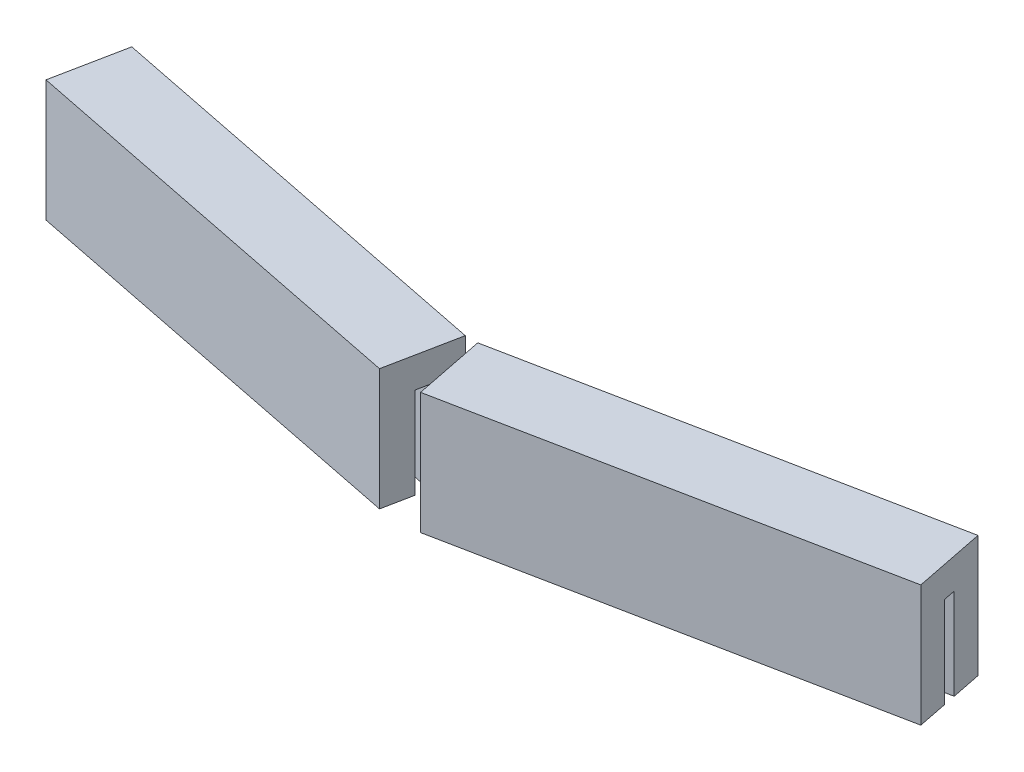
ISO-10303-21;
HEADER;
FILE_DESCRIPTION(('STEP AP214'),'2;1');
FILE_NAME('part.step','',(''),(''),'','','');
FILE_SCHEMA(('AUTOMOTIVE_DESIGN { 1 0 10303 214 1 1 1 1 }'));
ENDSEC;
DATA;
#1=APPLICATION_CONTEXT('core data for automotive mechanical design processes');
#2=APPLICATION_PROTOCOL_DEFINITION('international standard','automotive_design',2000,#1);
#3=PRODUCT_CONTEXT('',#1,'mechanical');
#4=PRODUCT('Part','Part','',(#3));
#5=PRODUCT_RELATED_PRODUCT_CATEGORY('part','',(#4));
#6=PRODUCT_DEFINITION_FORMATION('','',#4);
#7=PRODUCT_DEFINITION_CONTEXT('part definition',#1,'design');
#8=PRODUCT_DEFINITION('design','',#6,#7);
#9=PRODUCT_DEFINITION_SHAPE('','',#8);
#10=(LENGTH_UNIT() NAMED_UNIT(*) SI_UNIT(.MILLI.,.METRE.));
#11=(NAMED_UNIT(*) PLANE_ANGLE_UNIT() SI_UNIT($,.RADIAN.));
#12=(NAMED_UNIT(*) SI_UNIT($,.STERADIAN.) SOLID_ANGLE_UNIT());
#13=UNCERTAINTY_MEASURE_WITH_UNIT(LENGTH_MEASURE(1.E-05),#10,'distance_accuracy_value','');
#14=(GEOMETRIC_REPRESENTATION_CONTEXT(3) GLOBAL_UNCERTAINTY_ASSIGNED_CONTEXT((#13)) GLOBAL_UNIT_ASSIGNED_CONTEXT((#10,
#11,#12)) REPRESENTATION_CONTEXT('',''));
#15=CARTESIAN_POINT('',(0.,0.,0.));
#16=DIRECTION('',(0.,0.,1.));
#17=DIRECTION('',(1.,0.,0.));
#18=AXIS2_PLACEMENT_3D('',#15,#16,#17);
#19=CARTESIAN_POINT('',(22.7660769993046,5.,96.7807247493332));
#20=DIRECTION('',(-0.980580675690921,0.,-0.196116135138181));
#21=DIRECTION('',(-0.196116135138181,0.,0.980580675690921));
#22=AXIS2_PLACEMENT_3D('',#19,#20,#21);
#23=PLANE('',#22);
#24=DIRECTION('',(0.196116135138181,0.,-0.980580675690921));
#25=VECTOR('',#24,1.);
#26=CARTESIAN_POINT('',(22.7660769993046,0.,96.7807247493332));
#27=LINE('',#26,#25);
#28=CARTESIAN_POINT('',(22.7660769993046,0.,96.7807247493332));
#29=VERTEX_POINT('',#28);
#30=CARTESIAN_POINT('',(23.158309269581,0.,94.8195633979514));
#31=VERTEX_POINT('',#30);
#32=EDGE_CURVE('E62',#29,#31,#27,.T.);
#33=ORIENTED_EDGE('',*,*,#32,.T.);
#34=DIRECTION('',(0.,1.,0.));
#35=VECTOR('',#34,1.);
#36=CARTESIAN_POINT('',(23.158309269581,-15.,94.8195633979514));
#37=LINE('',#36,#35);
#38=CARTESIAN_POINT('',(23.158309269581,-15.,94.8195633979514));
#39=VERTEX_POINT('',#38);
#40=EDGE_CURVE('E152',#39,#31,#37,.T.);
#41=ORIENTED_EDGE('',*,*,#40,.F.);
#42=DIRECTION('',(0.196116135138182,0.,-0.980580675690921));
#43=VECTOR('',#42,1.);
#44=CARTESIAN_POINT('',(24.1388899452719,-15.,89.9166600194968));
#45=LINE('',#44,#43);
#46=CARTESIAN_POINT('',(24.1388899452719,-15.,89.9166600194968));
#47=VERTEX_POINT('',#46);
#48=EDGE_CURVE('E146',#39,#47,#45,.T.);
#49=ORIENTED_EDGE('',*,*,#48,.T.);
#50=DIRECTION('',(0.,1.,0.));
#51=VECTOR('',#50,1.);
#52=CARTESIAN_POINT('',(24.1388899452719,-15.,89.9166600194968));
#53=LINE('',#52,#51);
#54=CARTESIAN_POINT('',(24.1388899452719,5.,89.9166600194968));
#55=VERTEX_POINT('',#54);
#56=EDGE_CURVE('E136',#47,#55,#53,.T.);
#57=ORIENTED_EDGE('',*,*,#56,.T.);
#58=DIRECTION('',(0.196116135138181,0.,-0.980580675690921));
#59=VECTOR('',#58,1.);
#60=CARTESIAN_POINT('',(22.7660769993046,5.,96.7807247493332));
#61=LINE('',#60,#59);
#62=CARTESIAN_POINT('',(21.7854963236139,5.,101.683628127787));
#63=VERTEX_POINT('',#62);
#64=EDGE_CURVE('E57',#63,#55,#61,.T.);
#65=ORIENTED_EDGE('',*,*,#64,.F.);
#66=DIRECTION('',(0.,1.,0.));
#67=VECTOR('',#66,1.);
#68=CARTESIAN_POINT('',(21.7854963236139,-15.,101.683628127787));
#69=LINE('',#68,#67);
#70=CARTESIAN_POINT('',(21.7854963236139,-15.,101.683628127787));
#71=VERTEX_POINT('',#70);
#72=EDGE_CURVE('E165',#71,#63,#69,.T.);
#73=ORIENTED_EDGE('',*,*,#72,.F.);
#74=DIRECTION('',(0.196116135138173,0.,-0.980580675690922));
#75=VECTOR('',#74,1.);
#76=CARTESIAN_POINT('',(21.7854963236139,-15.,101.683628127787));
#77=LINE('',#76,#75);
#78=CARTESIAN_POINT('',(22.7660769993046,-15.,96.7807247493332));
#79=VERTEX_POINT('',#78);
#80=EDGE_CURVE('E158',#71,#79,#77,.T.);
#81=ORIENTED_EDGE('',*,*,#80,.T.);
#82=DIRECTION('',(0.,1.,0.));
#83=VECTOR('',#82,1.);
#84=CARTESIAN_POINT('',(22.7660769993046,-15.,96.7807247493332));
#85=LINE('',#84,#83);
#86=EDGE_CURVE('E171',#79,#29,#85,.T.);
#87=ORIENTED_EDGE('',*,*,#86,.T.);
#88=EDGE_LOOP('',(#33,#41,#49,#57,#65,#73,#81,#87));
#89=FACE_BOUND('',#88,.T.);
#90=ADVANCED_FACE('F53',(#89),#23,.F.);
#91=CARTESIAN_POINT('',(-45.4823380287835,5.,81.0914339382787));
#92=DIRECTION('',(0.980580675690921,0.,0.196116135138178));
#93=DIRECTION('',(0.196116135138178,0.,-0.980580675690921));
#94=AXIS2_PLACEMENT_3D('',#91,#92,#93);
#95=PLANE('',#94);
#96=DIRECTION('',(-0.196116135138178,0.,0.980580675690921));
#97=VECTOR('',#96,1.);
#98=CARTESIAN_POINT('',(-45.4823380287835,0.,81.0914339382787));
#99=LINE('',#98,#97);
#100=CARTESIAN_POINT('',(-45.4823380287835,0.,81.0914339382787));
#101=VERTEX_POINT('',#100);
#102=CARTESIAN_POINT('',(-45.8745702990598,0.,83.0525952896605));
#103=VERTEX_POINT('',#102);
#104=EDGE_CURVE('E77',#101,#103,#99,.T.);
#105=ORIENTED_EDGE('',*,*,#104,.T.);
#106=DIRECTION('',(0.,1.,0.));
#107=VECTOR('',#106,1.);
#108=CARTESIAN_POINT('',(-45.8745702990598,-15.,83.0525952896605));
#109=LINE('',#108,#107);
#110=CARTESIAN_POINT('',(-45.8745702990598,-15.,83.0525952896605));
#111=VERTEX_POINT('',#110);
#112=EDGE_CURVE('E168',#111,#103,#109,.T.);
#113=ORIENTED_EDGE('',*,*,#112,.F.);
#114=DIRECTION('',(-0.196116135138174,0.,0.980580675690922));
#115=VECTOR('',#114,1.);
#116=CARTESIAN_POINT('',(-45.8745702990598,-15.,83.0525952896605));
#117=LINE('',#116,#115);
#118=CARTESIAN_POINT('',(-46.8551509747507,-15.,87.9554986681151));
#119=VERTEX_POINT('',#118);
#120=EDGE_CURVE('E164',#111,#119,#117,.T.);
#121=ORIENTED_EDGE('',*,*,#120,.T.);
#122=DIRECTION('',(0.,1.,0.));
#123=VECTOR('',#122,1.);
#124=CARTESIAN_POINT('',(-46.8551509747507,-15.,87.9554986681151));
#125=LINE('',#124,#123);
#126=CARTESIAN_POINT('',(-46.8551509747507,5.,87.9554986681151));
#127=VERTEX_POINT('',#126);
#128=EDGE_CURVE('E124',#119,#127,#125,.T.);
#129=ORIENTED_EDGE('',*,*,#128,.T.);
#130=DIRECTION('',(-0.196116135138178,0.,0.980580675690921));
#131=VECTOR('',#130,1.);
#132=CARTESIAN_POINT('',(-45.4823380287835,5.,81.0914339382787));
#133=LINE('',#132,#131);
#134=CARTESIAN_POINT('',(-44.5017573530925,5.,76.1885305598241));
#135=VERTEX_POINT('',#134);
#136=EDGE_CURVE('E117',#135,#127,#133,.T.);
#137=ORIENTED_EDGE('',*,*,#136,.F.);
#138=DIRECTION('',(0.,1.,0.));
#139=VECTOR('',#138,1.);
#140=CARTESIAN_POINT('',(-44.5017573530925,-15.,76.1885305598241));
#141=LINE('',#140,#139);
#142=CARTESIAN_POINT('',(-44.5017573530925,-15.,76.1885305598241));
#143=VERTEX_POINT('',#142);
#144=EDGE_CURVE('E121',#143,#135,#141,.T.);
#145=ORIENTED_EDGE('',*,*,#144,.F.);
#146=DIRECTION('',(-0.196116135138182,0.,0.980580675690921));
#147=VECTOR('',#146,1.);
#148=CARTESIAN_POINT('',(-45.4823380287835,-15.,81.0914339382787));
#149=LINE('',#148,#147);
#150=CARTESIAN_POINT('',(-45.4823380287835,-15.,81.0914339382787));
#151=VERTEX_POINT('',#150);
#152=EDGE_CURVE('E150',#143,#151,#149,.T.);
#153=ORIENTED_EDGE('',*,*,#152,.T.);
#154=DIRECTION('',(0.,1.,0.));
#155=VECTOR('',#154,1.);
#156=CARTESIAN_POINT('',(-45.4823380287835,-15.,81.0914339382787));
#157=LINE('',#156,#155);
#158=EDGE_CURVE('E137',#151,#101,#157,.T.);
#159=ORIENTED_EDGE('',*,*,#158,.T.);
#160=EDGE_LOOP('',(#105,#113,#121,#129,#137,#145,#153,#159));
#161=FACE_BOUND('',#160,.T.);
#162=ADVANCED_FACE('F119',(#161),#95,.F.);
#163=CARTESIAN_POINT('',(0.,5.,0.));
#164=DIRECTION('',(0.,1.,0.));
#165=DIRECTION('',(0.,0.,1.));
#166=AXIS2_PLACEMENT_3D('',#163,#164,#165);
#167=PLANE('',#166);
#168=ORIENTED_EDGE('',*,*,#136,.T.);
#169=DIRECTION('',(0.980580675690922,0.,0.196116135138174));
#170=VECTOR('',#169,1.);
#171=CARTESIAN_POINT('',(-46.8551509747507,5.,87.9554986681151));
#172=LINE('',#171,#170);
#173=EDGE_CURVE('E140',#127,#63,#172,.T.);
#174=ORIENTED_EDGE('',*,*,#173,.T.);
#175=ORIENTED_EDGE('',*,*,#64,.T.);
#176=DIRECTION('',(-0.980580675690921,0.,-0.196116135138182));
#177=VECTOR('',#176,1.);
#178=CARTESIAN_POINT('',(-44.5017573530925,5.,76.1885305598241));
#179=LINE('',#178,#177);
#180=EDGE_CURVE('E132',#55,#135,#179,.T.);
#181=ORIENTED_EDGE('',*,*,#180,.T.);
#182=EDGE_LOOP('',(#168,#174,#175,#181));
#183=FACE_BOUND('',#182,.T.);
#184=ADVANCED_FACE('F55',(#183),#167,.T.);
#185=CARTESIAN_POINT('',(0.,0.,0.));
#186=DIRECTION('',(0.,1.,0.));
#187=DIRECTION('',(0.,0.,1.));
#188=AXIS2_PLACEMENT_3D('',#185,#186,#187);
#189=PLANE('',#188);
#190=DIRECTION('',(0.980580675690921,0.,0.196116135138182));
#191=VECTOR('',#190,1.);
#192=CARTESIAN_POINT('',(-45.8745702990598,0.,83.0525952896605));
#193=LINE('',#192,#191);
#194=EDGE_CURVE('E12',#103,#29,#193,.T.);
#195=ORIENTED_EDGE('',*,*,#194,.F.);
#196=ORIENTED_EDGE('',*,*,#104,.F.);
#197=DIRECTION('',(-0.980580675690921,0.,-0.196116135138182));
#198=VECTOR('',#197,1.);
#199=CARTESIAN_POINT('',(23.158309269581,0.,94.8195633979514));
#200=LINE('',#199,#198);
#201=EDGE_CURVE('E176',#31,#101,#200,.T.);
#202=ORIENTED_EDGE('',*,*,#201,.F.);
#203=ORIENTED_EDGE('',*,*,#32,.F.);
#204=EDGE_LOOP('',(#195,#196,#202,#203));
#205=FACE_BOUND('',#204,.T.);
#206=ADVANCED_FACE('F199',(#205),#189,.F.);
#207=CARTESIAN_POINT('',(22.7660769993046,-15.,96.7807247493332));
#208=DIRECTION('',(0.196116135138182,0.,-0.980580675690921));
#209=DIRECTION('',(-0.980580675690921,0.,-0.196116135138182));
#210=AXIS2_PLACEMENT_3D('',#207,#208,#209);
#211=PLANE('',#210);
#212=ORIENTED_EDGE('',*,*,#194,.T.);
#213=ORIENTED_EDGE('',*,*,#86,.F.);
#214=DIRECTION('',(-0.980580675690921,0.,-0.196116135138182));
#215=VECTOR('',#214,1.);
#216=CARTESIAN_POINT('',(22.7660769993046,-15.,96.7807247493332));
#217=LINE('',#216,#215);
#218=EDGE_CURVE('E161',#79,#111,#217,.T.);
#219=ORIENTED_EDGE('',*,*,#218,.T.);
#220=ORIENTED_EDGE('',*,*,#112,.T.);
#221=EDGE_LOOP('',(#212,#213,#219,#220));
#222=FACE_BOUND('',#221,.T.);
#223=ADVANCED_FACE('F198',(#222),#211,.T.);
#224=CARTESIAN_POINT('',(-46.8551509747507,-15.,87.9554986681151));
#225=DIRECTION('',(-0.196116135138174,0.,0.980580675690922));
#226=DIRECTION('',(0.980580675690922,0.,0.196116135138174));
#227=AXIS2_PLACEMENT_3D('',#224,#225,#226);
#228=PLANE('',#227);
#229=ORIENTED_EDGE('',*,*,#173,.F.);
#230=ORIENTED_EDGE('',*,*,#128,.F.);
#231=DIRECTION('',(0.980580675690922,0.,0.196116135138174));
#232=VECTOR('',#231,1.);
#233=CARTESIAN_POINT('',(-46.8551509747507,-15.,87.9554986681151));
#234=LINE('',#233,#232);
#235=EDGE_CURVE('E143',#119,#71,#234,.T.);
#236=ORIENTED_EDGE('',*,*,#235,.T.);
#237=ORIENTED_EDGE('',*,*,#72,.T.);
#238=EDGE_LOOP('',(#229,#230,#236,#237));
#239=FACE_BOUND('',#238,.T.);
#240=ADVANCED_FACE('F191',(#239),#228,.T.);
#241=CARTESIAN_POINT('',(0.,-15.,0.));
#242=DIRECTION('',(0.,1.,0.));
#243=DIRECTION('',(0.,0.,1.));
#244=AXIS2_PLACEMENT_3D('',#241,#242,#243);
#245=PLANE('',#244);
#246=ORIENTED_EDGE('',*,*,#235,.F.);
#247=ORIENTED_EDGE('',*,*,#120,.F.);
#248=ORIENTED_EDGE('',*,*,#218,.F.);
#249=ORIENTED_EDGE('',*,*,#80,.F.);
#250=EDGE_LOOP('',(#246,#247,#248,#249));
#251=FACE_BOUND('',#250,.T.);
#252=ADVANCED_FACE('F195',(#251),#245,.F.);
#253=CARTESIAN_POINT('',(23.158309269581,-15.,94.8195633979514));
#254=DIRECTION('',(-0.196116135138182,0.,0.980580675690921));
#255=DIRECTION('',(0.980580675690921,0.,0.196116135138182));
#256=AXIS2_PLACEMENT_3D('',#253,#254,#255);
#257=PLANE('',#256);
#258=ORIENTED_EDGE('',*,*,#201,.T.);
#259=ORIENTED_EDGE('',*,*,#158,.F.);
#260=DIRECTION('',(0.980580675690921,0.,0.196116135138182));
#261=VECTOR('',#260,1.);
#262=CARTESIAN_POINT('',(23.158309269581,-15.,94.8195633979514));
#263=LINE('',#262,#261);
#264=EDGE_CURVE('E141',#151,#39,#263,.T.);
#265=ORIENTED_EDGE('',*,*,#264,.T.);
#266=ORIENTED_EDGE('',*,*,#40,.T.);
#267=EDGE_LOOP('',(#258,#259,#265,#266));
#268=FACE_BOUND('',#267,.T.);
#269=ADVANCED_FACE('F181',(#268),#257,.T.);
#270=CARTESIAN_POINT('',(-44.5017573530925,-15.,76.1885305598241));
#271=DIRECTION('',(0.196116135138182,0.,-0.980580675690921));
#272=DIRECTION('',(-0.980580675690921,0.,-0.196116135138182));
#273=AXIS2_PLACEMENT_3D('',#270,#271,#272);
#274=PLANE('',#273);
#275=ORIENTED_EDGE('',*,*,#180,.F.);
#276=ORIENTED_EDGE('',*,*,#56,.F.);
#277=DIRECTION('',(-0.980580675690921,0.,-0.196116135138182));
#278=VECTOR('',#277,1.);
#279=CARTESIAN_POINT('',(-44.5017573530925,-15.,76.1885305598241));
#280=LINE('',#279,#278);
#281=EDGE_CURVE('E134',#47,#143,#280,.T.);
#282=ORIENTED_EDGE('',*,*,#281,.T.);
#283=ORIENTED_EDGE('',*,*,#144,.T.);
#284=EDGE_LOOP('',(#275,#276,#282,#283));
#285=FACE_BOUND('',#284,.T.);
#286=ADVANCED_FACE('F131',(#285),#274,.T.);
#287=CARTESIAN_POINT('',(0.,-15.,0.));
#288=DIRECTION('',(0.,-1.,0.));
#289=DIRECTION('',(0.,0.,-1.));
#290=AXIS2_PLACEMENT_3D('',#287,#288,#289);
#291=PLANE('',#290);
#292=ORIENTED_EDGE('',*,*,#264,.F.);
#293=ORIENTED_EDGE('',*,*,#152,.F.);
#294=ORIENTED_EDGE('',*,*,#281,.F.);
#295=ORIENTED_EDGE('',*,*,#48,.F.);
#296=EDGE_LOOP('',(#292,#293,#294,#295));
#297=FACE_BOUND('',#296,.T.);
#298=ADVANCED_FACE('F185',(#297),#291,.T.);
#299=CLOSED_SHELL('',(#90,#162,#184,#206,#223,#240,#252,#269,#286,#298));
#300=MANIFOLD_SOLID_BREP('B2',#299);
#301=CARTESIAN_POINT('',(27.1702274295357,5.,94.8195633979514));
#302=DIRECTION('',(0.980580675690921,0.,-0.19611613513818));
#303=DIRECTION('',(-0.19611613513818,0.,-0.980580675690921));
#304=AXIS2_PLACEMENT_3D('',#301,#302,#303);
#305=PLANE('',#304);
#306=DIRECTION('',(0.19611613513818,0.,0.980580675690921));
#307=VECTOR('',#306,1.);
#308=CARTESIAN_POINT('',(27.1702274295357,0.,94.8195633979514));
#309=LINE('',#308,#307);
#310=CARTESIAN_POINT('',(27.1702274295357,0.,94.8195633979514));
#311=VERTEX_POINT('',#310);
#312=CARTESIAN_POINT('',(27.562459699812,0.,96.7807247493332));
#313=VERTEX_POINT('',#312);
#314=EDGE_CURVE('E343',#311,#313,#309,.T.);
#315=ORIENTED_EDGE('',*,*,#314,.T.);
#316=DIRECTION('',(0.,1.,0.));
#317=VECTOR('',#316,1.);
#318=CARTESIAN_POINT('',(27.562459699812,-15.,96.7807247493332));
#319=LINE('',#318,#317);
#320=CARTESIAN_POINT('',(27.562459699812,-15.,96.7807247493332));
#321=VERTEX_POINT('',#320);
#322=EDGE_CURVE('E401',#321,#313,#319,.T.);
#323=ORIENTED_EDGE('',*,*,#322,.F.);
#324=DIRECTION('',(0.196116135138178,0.,0.980580675690921));
#325=VECTOR('',#324,1.);
#326=CARTESIAN_POINT('',(27.562459699812,-15.,96.7807247493332));
#327=LINE('',#326,#325);
#328=CARTESIAN_POINT('',(28.5430403755029,-15.,101.683628127788));
#329=VERTEX_POINT('',#328);
#330=EDGE_CURVE('E396',#321,#329,#327,.T.);
#331=ORIENTED_EDGE('',*,*,#330,.T.);
#332=DIRECTION('',(0.,1.,0.));
#333=VECTOR('',#332,1.);
#334=CARTESIAN_POINT('',(28.5430403755029,-15.,101.683628127788));
#335=LINE('',#334,#333);
#336=CARTESIAN_POINT('',(28.5430403755029,5.,101.683628127788));
#337=VERTEX_POINT('',#336);
#338=EDGE_CURVE('E394',#329,#337,#335,.T.);
#339=ORIENTED_EDGE('',*,*,#338,.T.);
#340=DIRECTION('',(0.19611613513818,0.,0.980580675690921));
#341=VECTOR('',#340,1.);
#342=CARTESIAN_POINT('',(27.1702274295357,5.,94.8195633979514));
#343=LINE('',#342,#341);
#344=CARTESIAN_POINT('',(26.1896467538448,5.,89.9166600194968));
#345=VERTEX_POINT('',#344);
#346=EDGE_CURVE('E328',#345,#337,#343,.T.);
#347=ORIENTED_EDGE('',*,*,#346,.F.);
#348=DIRECTION('',(0.,1.,0.));
#349=VECTOR('',#348,1.);
#350=CARTESIAN_POINT('',(26.1896467538448,-15.,89.9166600194968));
#351=LINE('',#350,#349);
#352=CARTESIAN_POINT('',(26.1896467538448,-15.,89.9166600194968));
#353=VERTEX_POINT('',#352);
#354=EDGE_CURVE('E412',#353,#345,#351,.T.);
#355=ORIENTED_EDGE('',*,*,#354,.F.);
#356=DIRECTION('',(0.196116135138181,0.,0.980580675690921));
#357=VECTOR('',#356,1.);
#358=CARTESIAN_POINT('',(27.1702274295357,-15.,94.8195633979514));
#359=LINE('',#358,#357);
#360=CARTESIAN_POINT('',(27.1702274295357,-15.,94.8195633979514));
#361=VERTEX_POINT('',#360);
#362=EDGE_CURVE('E431',#353,#361,#359,.T.);
#363=ORIENTED_EDGE('',*,*,#362,.T.);
#364=DIRECTION('',(0.,1.,0.));
#365=VECTOR('',#364,1.);
#366=CARTESIAN_POINT('',(27.1702274295357,-15.,94.8195633979514));
#367=LINE('',#366,#365);
#368=EDGE_CURVE('E407',#361,#311,#367,.T.);
#369=ORIENTED_EDGE('',*,*,#368,.T.);
#370=EDGE_LOOP('',(#315,#323,#331,#339,#347,#355,#363,#369));
#371=FACE_BOUND('',#370,.T.);
#372=ADVANCED_FACE('F319',(#371),#305,.F.);
#373=CARTESIAN_POINT('',(95.8108747279001,5.,81.0914339382787));
#374=DIRECTION('',(-0.980580675690921,0.,0.196116135138181));
#375=DIRECTION('',(0.196116135138181,0.,0.980580675690921));
#376=AXIS2_PLACEMENT_3D('',#373,#374,#375);
#377=PLANE('',#376);
#378=DIRECTION('',(-0.196116135138181,0.,-0.980580675690921));
#379=VECTOR('',#378,1.);
#380=CARTESIAN_POINT('',(95.8108747279001,0.,81.0914339382787));
#381=LINE('',#380,#379);
#382=CARTESIAN_POINT('',(96.2031069981765,0.,83.0525952896605));
#383=VERTEX_POINT('',#382);
#384=CARTESIAN_POINT('',(95.8108747279001,0.,81.0914339382787));
#385=VERTEX_POINT('',#384);
#386=EDGE_CURVE('E322',#383,#385,#381,.T.);
#387=ORIENTED_EDGE('',*,*,#386,.T.);
#388=DIRECTION('',(0.,1.,0.));
#389=VECTOR('',#388,1.);
#390=CARTESIAN_POINT('',(95.8108747279001,-15.,81.0914339382787));
#391=LINE('',#390,#389);
#392=CARTESIAN_POINT('',(95.8108747279001,-15.,81.0914339382787));
#393=VERTEX_POINT('',#392);
#394=EDGE_CURVE('E427',#393,#385,#391,.T.);
#395=ORIENTED_EDGE('',*,*,#394,.F.);
#396=DIRECTION('',(-0.19611613513818,0.,-0.980580675690921));
#397=VECTOR('',#396,1.);
#398=CARTESIAN_POINT('',(94.8302940522092,-15.,76.1885305598241));
#399=LINE('',#398,#397);
#400=CARTESIAN_POINT('',(94.8302940522092,-15.,76.1885305598241));
#401=VERTEX_POINT('',#400);
#402=EDGE_CURVE('E449',#393,#401,#399,.T.);
#403=ORIENTED_EDGE('',*,*,#402,.T.);
#404=DIRECTION('',(0.,1.,0.));
#405=VECTOR('',#404,1.);
#406=CARTESIAN_POINT('',(94.8302940522092,-15.,76.1885305598241));
#407=LINE('',#406,#405);
#408=CARTESIAN_POINT('',(94.8302940522092,5.,76.1885305598241));
#409=VERTEX_POINT('',#408);
#410=EDGE_CURVE('E432',#401,#409,#407,.T.);
#411=ORIENTED_EDGE('',*,*,#410,.T.);
#412=DIRECTION('',(-0.196116135138181,0.,-0.980580675690921));
#413=VECTOR('',#412,1.);
#414=CARTESIAN_POINT('',(95.8108747279001,5.,81.0914339382787));
#415=LINE('',#414,#413);
#416=CARTESIAN_POINT('',(97.1836876738674,5.,87.9554986681154));
#417=VERTEX_POINT('',#416);
#418=EDGE_CURVE('E51',#417,#409,#415,.T.);
#419=ORIENTED_EDGE('',*,*,#418,.F.);
#420=DIRECTION('',(0.,1.,0.));
#421=VECTOR('',#420,1.);
#422=CARTESIAN_POINT('',(97.1836876738674,-15.,87.9554986681154));
#423=LINE('',#422,#421);
#424=CARTESIAN_POINT('',(97.1836876738674,-15.,87.9554986681154));
#425=VERTEX_POINT('',#424);
#426=EDGE_CURVE('E405',#425,#417,#423,.T.);
#427=ORIENTED_EDGE('',*,*,#426,.F.);
#428=DIRECTION('',(-0.196116135138177,0.,-0.980580675690922));
#429=VECTOR('',#428,1.);
#430=CARTESIAN_POINT('',(97.1836876738674,-15.,87.9554986681154));
#431=LINE('',#430,#429);
#432=CARTESIAN_POINT('',(96.2031069981765,-15.,83.0525952896605));
#433=VERTEX_POINT('',#432);
#434=EDGE_CURVE('E414',#425,#433,#431,.T.);
#435=ORIENTED_EDGE('',*,*,#434,.T.);
#436=DIRECTION('',(0.,1.,0.));
#437=VECTOR('',#436,1.);
#438=CARTESIAN_POINT('',(96.2031069981765,-15.,83.0525952896605));
#439=LINE('',#438,#437);
#440=EDGE_CURVE('E467',#433,#383,#439,.T.);
#441=ORIENTED_EDGE('',*,*,#440,.T.);
#442=EDGE_LOOP('',(#387,#395,#403,#411,#419,#427,#435,#441));
#443=FACE_BOUND('',#442,.T.);
#444=ADVANCED_FACE('F470',(#443),#377,.F.);
#445=CARTESIAN_POINT('',(0.,5.,0.));
#446=DIRECTION('',(0.,-1.,0.));
#447=DIRECTION('',(0.,0.,-1.));
#448=AXIS2_PLACEMENT_3D('',#445,#446,#447);
#449=PLANE('',#448);
#450=ORIENTED_EDGE('',*,*,#418,.T.);
#451=DIRECTION('',(-0.980580675690921,0.,0.196116135138182));
#452=VECTOR('',#451,1.);
#453=CARTESIAN_POINT('',(26.1896467538448,5.,89.9166600194968));
#454=LINE('',#453,#452);
#455=EDGE_CURVE('E389',#409,#345,#454,.T.);
#456=ORIENTED_EDGE('',*,*,#455,.T.);
#457=ORIENTED_EDGE('',*,*,#346,.T.);
#458=DIRECTION('',(0.980580675690921,0.,-0.196116135138177));
#459=VECTOR('',#458,1.);
#460=CARTESIAN_POINT('',(28.5430403755029,5.,101.683628127788));
#461=LINE('',#460,#459);
#462=EDGE_CURVE('E387',#337,#417,#461,.T.);
#463=ORIENTED_EDGE('',*,*,#462,.T.);
#464=EDGE_LOOP('',(#450,#456,#457,#463));
#465=FACE_BOUND('',#464,.T.);
#466=ADVANCED_FACE('F385',(#465),#449,.F.);
#467=CARTESIAN_POINT('',(0.,0.,0.));
#468=DIRECTION('',(0.,-1.,0.));
#469=DIRECTION('',(0.,0.,-1.));
#470=AXIS2_PLACEMENT_3D('',#467,#468,#469);
#471=PLANE('',#470);
#472=DIRECTION('',(-0.980580675690921,0.,0.196116135138182));
#473=VECTOR('',#472,1.);
#474=CARTESIAN_POINT('',(27.1702274295357,0.,94.8195633979514));
#475=LINE('',#474,#473);
#476=EDGE_CURVE('E440',#385,#311,#475,.T.);
#477=ORIENTED_EDGE('',*,*,#476,.F.);
#478=ORIENTED_EDGE('',*,*,#386,.F.);
#479=DIRECTION('',(0.980580675690921,0.,-0.196116135138182));
#480=VECTOR('',#479,1.);
#481=CARTESIAN_POINT('',(96.2031069981765,0.,83.0525952896605));
#482=LINE('',#481,#480);
#483=EDGE_CURVE('E460',#313,#383,#482,.T.);
#484=ORIENTED_EDGE('',*,*,#483,.F.);
#485=ORIENTED_EDGE('',*,*,#314,.F.);
#486=EDGE_LOOP('',(#477,#478,#484,#485));
#487=FACE_BOUND('',#486,.T.);
#488=ADVANCED_FACE('F493',(#487),#471,.T.);
#489=CARTESIAN_POINT('',(95.8108747279001,-15.,81.0914339382787));
#490=DIRECTION('',(0.196116135138182,0.,0.980580675690921));
#491=DIRECTION('',(0.980580675690921,0.,-0.196116135138182));
#492=AXIS2_PLACEMENT_3D('',#489,#490,#491);
#493=PLANE('',#492);
#494=ORIENTED_EDGE('',*,*,#394,.T.);
#495=ORIENTED_EDGE('',*,*,#476,.T.);
#496=ORIENTED_EDGE('',*,*,#368,.F.);
#497=DIRECTION('',(0.980580675690921,0.,-0.196116135138182));
#498=VECTOR('',#497,1.);
#499=CARTESIAN_POINT('',(95.8108747279001,-15.,81.0914339382787));
#500=LINE('',#499,#498);
#501=EDGE_CURVE('E441',#361,#393,#500,.T.);
#502=ORIENTED_EDGE('',*,*,#501,.T.);
#503=EDGE_LOOP('',(#494,#495,#496,#502));
#504=FACE_BOUND('',#503,.T.);
#505=ADVANCED_FACE('F497',(#504),#493,.T.);
#506=CARTESIAN_POINT('',(26.1896467538448,-15.,89.9166600194968));
#507=DIRECTION('',(-0.196116135138182,0.,-0.980580675690921));
#508=DIRECTION('',(-0.980580675690921,0.,0.196116135138182));
#509=AXIS2_PLACEMENT_3D('',#506,#507,#508);
#510=PLANE('',#509);
#511=ORIENTED_EDGE('',*,*,#455,.F.);
#512=ORIENTED_EDGE('',*,*,#410,.F.);
#513=DIRECTION('',(-0.980580675690921,0.,0.196116135138182));
#514=VECTOR('',#513,1.);
#515=CARTESIAN_POINT('',(26.1896467538448,-15.,89.9166600194968));
#516=LINE('',#515,#514);
#517=EDGE_CURVE('E445',#401,#353,#516,.T.);
#518=ORIENTED_EDGE('',*,*,#517,.T.);
#519=ORIENTED_EDGE('',*,*,#354,.T.);
#520=EDGE_LOOP('',(#511,#512,#518,#519));
#521=FACE_BOUND('',#520,.T.);
#522=ADVANCED_FACE('F502',(#521),#510,.T.);
#523=CARTESIAN_POINT('',(0.,-15.,0.));
#524=DIRECTION('',(0.,-1.,0.));
#525=DIRECTION('',(0.,0.,-1.));
#526=AXIS2_PLACEMENT_3D('',#523,#524,#525);
#527=PLANE('',#526);
#528=ORIENTED_EDGE('',*,*,#501,.F.);
#529=ORIENTED_EDGE('',*,*,#362,.F.);
#530=ORIENTED_EDGE('',*,*,#517,.F.);
#531=ORIENTED_EDGE('',*,*,#402,.F.);
#532=EDGE_LOOP('',(#528,#529,#530,#531));
#533=FACE_BOUND('',#532,.T.);
#534=ADVANCED_FACE('F499',(#533),#527,.T.);
#535=CARTESIAN_POINT('',(28.5430403755029,-15.,101.683628127788));
#536=DIRECTION('',(0.196116135138177,0.,0.980580675690922));
#537=DIRECTION('',(0.980580675690922,0.,-0.196116135138177));
#538=AXIS2_PLACEMENT_3D('',#535,#536,#537);
#539=PLANE('',#538);
#540=ORIENTED_EDGE('',*,*,#462,.F.);
#541=ORIENTED_EDGE('',*,*,#338,.F.);
#542=DIRECTION('',(0.980580675690921,0.,-0.196116135138177));
#543=VECTOR('',#542,1.);
#544=CARTESIAN_POINT('',(28.5430403755029,-15.,101.683628127788));
#545=LINE('',#544,#543);
#546=EDGE_CURVE('E408',#329,#425,#545,.T.);
#547=ORIENTED_EDGE('',*,*,#546,.T.);
#548=ORIENTED_EDGE('',*,*,#426,.T.);
#549=EDGE_LOOP('',(#540,#541,#547,#548));
#550=FACE_BOUND('',#549,.T.);
#551=ADVANCED_FACE('F404',(#550),#539,.T.);
#552=CARTESIAN_POINT('',(96.2031069981765,-15.,83.0525952896605));
#553=DIRECTION('',(-0.196116135138182,0.,-0.980580675690921));
#554=DIRECTION('',(-0.980580675690921,0.,0.196116135138182));
#555=AXIS2_PLACEMENT_3D('',#552,#553,#554);
#556=PLANE('',#555);
#557=ORIENTED_EDGE('',*,*,#322,.T.);
#558=ORIENTED_EDGE('',*,*,#483,.T.);
#559=ORIENTED_EDGE('',*,*,#440,.F.);
#560=DIRECTION('',(-0.980580675690921,0.,0.196116135138182));
#561=VECTOR('',#560,1.);
#562=CARTESIAN_POINT('',(96.2031069981765,-15.,83.0525952896605));
#563=LINE('',#562,#561);
#564=EDGE_CURVE('E420',#433,#321,#563,.T.);
#565=ORIENTED_EDGE('',*,*,#564,.T.);
#566=EDGE_LOOP('',(#557,#558,#559,#565));
#567=FACE_BOUND('',#566,.T.);
#568=ADVANCED_FACE('F466',(#567),#556,.T.);
#569=CARTESIAN_POINT('',(0.,-15.,0.));
#570=DIRECTION('',(0.,1.,0.));
#571=DIRECTION('',(0.,0.,1.));
#572=AXIS2_PLACEMENT_3D('',#569,#570,#571);
#573=PLANE('',#572);
#574=ORIENTED_EDGE('',*,*,#546,.F.);
#575=ORIENTED_EDGE('',*,*,#330,.F.);
#576=ORIENTED_EDGE('',*,*,#564,.F.);
#577=ORIENTED_EDGE('',*,*,#434,.F.);
#578=EDGE_LOOP('',(#574,#575,#576,#577));
#579=FACE_BOUND('',#578,.T.);
#580=ADVANCED_FACE('F478',(#579),#573,.F.);
#581=CLOSED_SHELL('',(#372,#444,#466,#488,#505,#522,#534,#551,#568,#580));
#582=MANIFOLD_SOLID_BREP('B6',#581);
#583=ADVANCED_BREP_SHAPE_REPRESENTATION('',(#18,#300,#582),#14);
#584=SHAPE_DEFINITION_REPRESENTATION(#9,#583);
ENDSEC;
END-ISO-10303-21;
